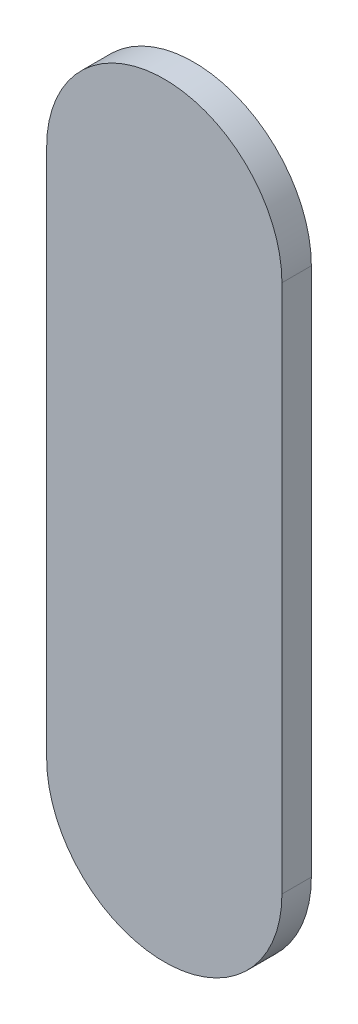
ISO-10303-21;
HEADER;
FILE_DESCRIPTION(('STEP AP214'),'2;1');
FILE_NAME('part.step','',(''),(''),'','','');
FILE_SCHEMA(('AUTOMOTIVE_DESIGN { 1 0 10303 214 1 1 1 1 }'));
ENDSEC;
DATA;
#1=APPLICATION_CONTEXT('core data for automotive mechanical design processes');
#2=APPLICATION_PROTOCOL_DEFINITION('international standard','automotive_design',2000,#1);
#3=PRODUCT_CONTEXT('',#1,'mechanical');
#4=PRODUCT('Part','Part','',(#3));
#5=PRODUCT_RELATED_PRODUCT_CATEGORY('part','',(#4));
#6=PRODUCT_DEFINITION_FORMATION('','',#4);
#7=PRODUCT_DEFINITION_CONTEXT('part definition',#1,'design');
#8=PRODUCT_DEFINITION('design','',#6,#7);
#9=PRODUCT_DEFINITION_SHAPE('','',#8);
#10=(LENGTH_UNIT() NAMED_UNIT(*) SI_UNIT(.MILLI.,.METRE.));
#11=(NAMED_UNIT(*) PLANE_ANGLE_UNIT() SI_UNIT($,.RADIAN.));
#12=(NAMED_UNIT(*) SI_UNIT($,.STERADIAN.) SOLID_ANGLE_UNIT());
#13=UNCERTAINTY_MEASURE_WITH_UNIT(LENGTH_MEASURE(1.E-05),#10,'distance_accuracy_value','');
#14=(GEOMETRIC_REPRESENTATION_CONTEXT(3) GLOBAL_UNCERTAINTY_ASSIGNED_CONTEXT((#13)) GLOBAL_UNIT_ASSIGNED_CONTEXT((#10,
#11,#12)) REPRESENTATION_CONTEXT('',''));
#15=CARTESIAN_POINT('',(0.,0.,0.));
#16=DIRECTION('',(0.,0.,1.));
#17=DIRECTION('',(1.,0.,0.));
#18=AXIS2_PLACEMENT_3D('',#15,#16,#17);
#19=CARTESIAN_POINT('',(40.,0.,10.));
#20=DIRECTION('',(1.,0.,0.));
#21=DIRECTION('',(0.,1.,0.));
#22=AXIS2_PLACEMENT_3D('',#19,#20,#21);
#23=PLANE('',#22);
#24=DIRECTION('',(0.,-1.,0.));
#25=VECTOR('',#24,1.);
#26=CARTESIAN_POINT('',(40.,0.,0.));
#27=LINE('',#26,#25);
#28=CARTESIAN_POINT('',(40.,0.,0.));
#29=VERTEX_POINT('',#28);
#30=CARTESIAN_POINT('',(40.,-180.,0.));
#31=VERTEX_POINT('',#30);
#32=EDGE_CURVE('E104',#29,#31,#27,.T.);
#33=ORIENTED_EDGE('',*,*,#32,.F.);
#34=DIRECTION('',(0.,0.,-1.));
#35=VECTOR('',#34,1.);
#36=CARTESIAN_POINT('',(40.,0.,10.));
#37=LINE('',#36,#35);
#38=CARTESIAN_POINT('',(40.,0.,10.));
#39=VERTEX_POINT('',#38);
#40=EDGE_CURVE('E11',#39,#29,#37,.T.);
#41=ORIENTED_EDGE('',*,*,#40,.F.);
#42=DIRECTION('',(0.,-1.,0.));
#43=VECTOR('',#42,1.);
#44=CARTESIAN_POINT('',(40.,0.,10.));
#45=LINE('',#44,#43);
#46=CARTESIAN_POINT('',(40.,-180.,10.));
#47=VERTEX_POINT('',#46);
#48=EDGE_CURVE('E92',#39,#47,#45,.T.);
#49=ORIENTED_EDGE('',*,*,#48,.T.);
#50=DIRECTION('',(0.,0.,-1.));
#51=VECTOR('',#50,1.);
#52=CARTESIAN_POINT('',(40.,-180.,10.));
#53=LINE('',#52,#51);
#54=EDGE_CURVE('E81',#47,#31,#53,.T.);
#55=ORIENTED_EDGE('',*,*,#54,.T.);
#56=EDGE_LOOP('',(#33,#41,#49,#55));
#57=FACE_BOUND('',#56,.T.);
#58=ADVANCED_FACE('F42',(#57),#23,.T.);
#59=CARTESIAN_POINT('',(0.,0.,10.));
#60=DIRECTION('',(0.,0.,-1.));
#61=DIRECTION('',(-1.,0.,0.));
#62=AXIS2_PLACEMENT_3D('',#59,#60,#61);
#63=CYLINDRICAL_SURFACE('',#62,40.);
#64=CARTESIAN_POINT('',(0.,0.,0.));
#65=DIRECTION('',(0.,0.,1.));
#66=DIRECTION('',(1.,0.,0.));
#67=AXIS2_PLACEMENT_3D('',#64,#65,#66);
#68=CIRCLE('',#67,40.);
#69=CARTESIAN_POINT('',(-40.,0.,0.));
#70=VERTEX_POINT('',#69);
#71=EDGE_CURVE('E97',#29,#70,#68,.T.);
#72=ORIENTED_EDGE('',*,*,#71,.T.);
#73=DIRECTION('',(0.,0.,-1.));
#74=VECTOR('',#73,1.);
#75=CARTESIAN_POINT('',(-40.,0.,10.));
#76=LINE('',#75,#74);
#77=CARTESIAN_POINT('',(-40.,0.,10.));
#78=VERTEX_POINT('',#77);
#79=EDGE_CURVE('E50',#78,#70,#76,.T.);
#80=ORIENTED_EDGE('',*,*,#79,.F.);
#81=CARTESIAN_POINT('',(0.,0.,10.));
#82=DIRECTION('',(0.,0.,1.));
#83=DIRECTION('',(1.,0.,0.));
#84=AXIS2_PLACEMENT_3D('',#81,#82,#83);
#85=CIRCLE('',#84,40.);
#86=EDGE_CURVE('E87',#39,#78,#85,.T.);
#87=ORIENTED_EDGE('',*,*,#86,.F.);
#88=ORIENTED_EDGE('',*,*,#40,.T.);
#89=EDGE_LOOP('',(#72,#80,#87,#88));
#90=FACE_BOUND('',#89,.T.);
#91=ADVANCED_FACE('F95',(#90),#63,.T.);
#92=CARTESIAN_POINT('',(-40.,0.,10.));
#93=DIRECTION('',(1.,0.,0.));
#94=DIRECTION('',(0.,1.,0.));
#95=AXIS2_PLACEMENT_3D('',#92,#93,#94);
#96=PLANE('',#95);
#97=DIRECTION('',(0.,-1.,0.));
#98=VECTOR('',#97,1.);
#99=CARTESIAN_POINT('',(-40.,0.,0.));
#100=LINE('',#99,#98);
#101=CARTESIAN_POINT('',(-40.,-180.,0.));
#102=VERTEX_POINT('',#101);
#103=EDGE_CURVE('E74',#70,#102,#100,.T.);
#104=ORIENTED_EDGE('',*,*,#103,.T.);
#105=DIRECTION('',(0.,0.,-1.));
#106=VECTOR('',#105,1.);
#107=CARTESIAN_POINT('',(-40.,-180.,10.));
#108=LINE('',#107,#106);
#109=CARTESIAN_POINT('',(-40.,-180.,10.));
#110=VERTEX_POINT('',#109);
#111=EDGE_CURVE('E98',#110,#102,#108,.T.);
#112=ORIENTED_EDGE('',*,*,#111,.F.);
#113=DIRECTION('',(0.,-1.,0.));
#114=VECTOR('',#113,1.);
#115=CARTESIAN_POINT('',(-40.,0.,10.));
#116=LINE('',#115,#114);
#117=EDGE_CURVE('E91',#78,#110,#116,.T.);
#118=ORIENTED_EDGE('',*,*,#117,.F.);
#119=ORIENTED_EDGE('',*,*,#79,.T.);
#120=EDGE_LOOP('',(#104,#112,#118,#119));
#121=FACE_BOUND('',#120,.T.);
#122=ADVANCED_FACE('F99',(#121),#96,.F.);
#123=CARTESIAN_POINT('',(0.,-180.,10.));
#124=DIRECTION('',(0.,0.,-1.));
#125=DIRECTION('',(-1.,0.,0.));
#126=AXIS2_PLACEMENT_3D('',#123,#124,#125);
#127=CYLINDRICAL_SURFACE('',#126,40.);
#128=CARTESIAN_POINT('',(0.,-180.,0.));
#129=DIRECTION('',(0.,0.,1.));
#130=DIRECTION('',(1.,0.,0.));
#131=AXIS2_PLACEMENT_3D('',#128,#129,#130);
#132=CIRCLE('',#131,40.);
#133=EDGE_CURVE('E109',#102,#31,#132,.T.);
#134=ORIENTED_EDGE('',*,*,#133,.T.);
#135=ORIENTED_EDGE('',*,*,#54,.F.);
#136=CARTESIAN_POINT('',(0.,-180.,10.));
#137=DIRECTION('',(0.,0.,1.));
#138=DIRECTION('',(1.,0.,0.));
#139=AXIS2_PLACEMENT_3D('',#136,#137,#138);
#140=CIRCLE('',#139,40.);
#141=EDGE_CURVE('E58',#110,#47,#140,.T.);
#142=ORIENTED_EDGE('',*,*,#141,.F.);
#143=ORIENTED_EDGE('',*,*,#111,.T.);
#144=EDGE_LOOP('',(#134,#135,#142,#143));
#145=FACE_BOUND('',#144,.T.);
#146=ADVANCED_FACE('F114',(#145),#127,.T.);
#147=CARTESIAN_POINT('',(0.,0.,10.));
#148=DIRECTION('',(0.,0.,1.));
#149=DIRECTION('',(1.,0.,0.));
#150=AXIS2_PLACEMENT_3D('',#147,#148,#149);
#151=PLANE('',#150);
#152=ORIENTED_EDGE('',*,*,#48,.F.);
#153=ORIENTED_EDGE('',*,*,#86,.T.);
#154=ORIENTED_EDGE('',*,*,#117,.T.);
#155=ORIENTED_EDGE('',*,*,#141,.T.);
#156=EDGE_LOOP('',(#152,#153,#154,#155));
#157=FACE_BOUND('',#156,.T.);
#158=ADVANCED_FACE('F89',(#157),#151,.T.);
#159=CARTESIAN_POINT('',(0.,0.,0.));
#160=DIRECTION('',(0.,0.,1.));
#161=DIRECTION('',(1.,0.,0.));
#162=AXIS2_PLACEMENT_3D('',#159,#160,#161);
#163=PLANE('',#162);
#164=ORIENTED_EDGE('',*,*,#32,.T.);
#165=ORIENTED_EDGE('',*,*,#133,.F.);
#166=ORIENTED_EDGE('',*,*,#103,.F.);
#167=ORIENTED_EDGE('',*,*,#71,.F.);
#168=EDGE_LOOP('',(#164,#165,#166,#167));
#169=FACE_BOUND('',#168,.T.);
#170=ADVANCED_FACE('F116',(#169),#163,.F.);
#171=CLOSED_SHELL('',(#58,#91,#122,#146,#158,#170));
#172=MANIFOLD_SOLID_BREP('B2',#171);
#173=ADVANCED_BREP_SHAPE_REPRESENTATION('',(#18,#172),#14);
#174=SHAPE_DEFINITION_REPRESENTATION(#9,#173);
ENDSEC;
END-ISO-10303-21;
